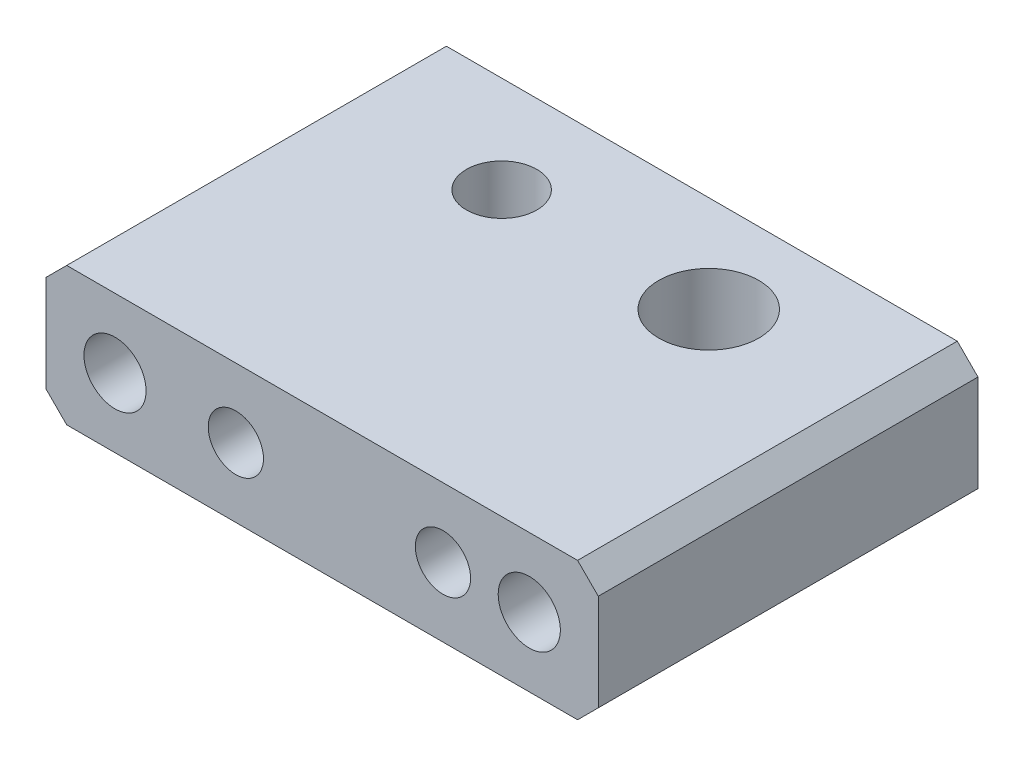
ISO-10303-21;
HEADER;
FILE_DESCRIPTION(('STEP AP214'),'2;1');
FILE_NAME('part.step','',(''),(''),'','','');
FILE_SCHEMA(('AUTOMOTIVE_DESIGN { 1 0 10303 214 1 1 1 1 }'));
ENDSEC;
DATA;
#1=APPLICATION_CONTEXT('core data for automotive mechanical design processes');
#2=APPLICATION_PROTOCOL_DEFINITION('international standard','automotive_design',2000,#1);
#3=PRODUCT_CONTEXT('',#1,'mechanical');
#4=PRODUCT('Part','Part','',(#3));
#5=PRODUCT_RELATED_PRODUCT_CATEGORY('part','',(#4));
#6=PRODUCT_DEFINITION_FORMATION('','',#4);
#7=PRODUCT_DEFINITION_CONTEXT('part definition',#1,'design');
#8=PRODUCT_DEFINITION('design','',#6,#7);
#9=PRODUCT_DEFINITION_SHAPE('','',#8);
#10=(LENGTH_UNIT() NAMED_UNIT(*) SI_UNIT(.MILLI.,.METRE.));
#11=(NAMED_UNIT(*) PLANE_ANGLE_UNIT() SI_UNIT($,.RADIAN.));
#12=(NAMED_UNIT(*) SI_UNIT($,.STERADIAN.) SOLID_ANGLE_UNIT());
#13=UNCERTAINTY_MEASURE_WITH_UNIT(LENGTH_MEASURE(1.E-05),#10,'distance_accuracy_value','');
#14=(GEOMETRIC_REPRESENTATION_CONTEXT(3) GLOBAL_UNCERTAINTY_ASSIGNED_CONTEXT((#13)) GLOBAL_UNIT_ASSIGNED_CONTEXT((#10,
#11,#12)) REPRESENTATION_CONTEXT('',''));
#15=CARTESIAN_POINT('',(0.,0.,0.));
#16=DIRECTION('',(0.,0.,1.));
#17=DIRECTION('',(1.,0.,0.));
#18=AXIS2_PLACEMENT_3D('',#15,#16,#17);
#19=CARTESIAN_POINT('',(0.,10.,0.));
#20=DIRECTION('',(1.,0.,0.));
#21=DIRECTION('',(0.,0.,-1.));
#22=AXIS2_PLACEMENT_3D('',#19,#20,#21);
#23=PLANE('',#22);
#24=DIRECTION('',(0.,-1.,0.));
#25=VECTOR('',#24,1.);
#26=CARTESIAN_POINT('',(0.,10.,0.));
#27=LINE('',#26,#25);
#28=CARTESIAN_POINT('',(0.,7.00000000000001,0.));
#29=VERTEX_POINT('',#28);
#30=CARTESIAN_POINT('',(0.,-7.00000000000001,0.));
#31=VERTEX_POINT('',#30);
#32=EDGE_CURVE('E189',#29,#31,#27,.T.);
#33=ORIENTED_EDGE('',*,*,#32,.F.);
#34=DIRECTION('',(0.,0.,-1.));
#35=VECTOR('',#34,1.);
#36=CARTESIAN_POINT('',(0.,7.00000000000001,0.));
#37=LINE('',#36,#35);
#38=CARTESIAN_POINT('',(0.,7.00000000000001,-55.));
#39=VERTEX_POINT('',#38);
#40=EDGE_CURVE('E209',#29,#39,#37,.T.);
#41=ORIENTED_EDGE('',*,*,#40,.T.);
#42=DIRECTION('',(0.,-1.,0.));
#43=VECTOR('',#42,1.);
#44=CARTESIAN_POINT('',(0.,10.,-55.));
#45=LINE('',#44,#43);
#46=CARTESIAN_POINT('',(0.,-7.00000000000001,-55.));
#47=VERTEX_POINT('',#46);
#48=EDGE_CURVE('E177',#39,#47,#45,.T.);
#49=ORIENTED_EDGE('',*,*,#48,.T.);
#50=DIRECTION('',(0.,0.,1.));
#51=VECTOR('',#50,1.);
#52=CARTESIAN_POINT('',(0.,-7.00000000000001,0.));
#53=LINE('',#52,#51);
#54=EDGE_CURVE('E206',#47,#31,#53,.T.);
#55=ORIENTED_EDGE('',*,*,#54,.T.);
#56=EDGE_LOOP('',(#33,#41,#49,#55));
#57=FACE_BOUND('',#56,.T.);
#58=ADVANCED_FACE('F41',(#57),#23,.F.);
#59=CARTESIAN_POINT('',(0.,10.,0.));
#60=DIRECTION('',(0.,0.,-1.));
#61=DIRECTION('',(-1.,0.,0.));
#62=AXIS2_PLACEMENT_3D('',#59,#60,#61);
#63=PLANE('',#62);
#64=CARTESIAN_POINT('',(27.5,0.,0.));
#65=DIRECTION('',(0.,0.,1.));
#66=DIRECTION('',(1.,0.,0.));
#67=AXIS2_PLACEMENT_3D('',#64,#65,#66);
#68=CIRCLE('',#67,3.99999999999999);
#69=CARTESIAN_POINT('',(31.5,0.,0.));
#70=VERTEX_POINT('',#69);
#71=EDGE_CURVE('E123',#70,#70,#68,.T.);
#72=ORIENTED_EDGE('',*,*,#71,.F.);
#73=EDGE_LOOP('',(#72));
#74=FACE_BOUND('',#73,.T.);
#75=CARTESIAN_POINT('',(57.5,0.,0.));
#76=DIRECTION('',(0.,0.,1.));
#77=DIRECTION('',(1.,0.,0.));
#78=AXIS2_PLACEMENT_3D('',#75,#76,#77);
#79=CIRCLE('',#78,3.99999999999999);
#80=CARTESIAN_POINT('',(61.5,0.,0.));
#81=VERTEX_POINT('',#80);
#82=EDGE_CURVE('E122',#81,#81,#79,.T.);
#83=ORIENTED_EDGE('',*,*,#82,.F.);
#84=EDGE_LOOP('',(#83));
#85=FACE_BOUND('',#84,.T.);
#86=CARTESIAN_POINT('',(70.,0.,0.));
#87=DIRECTION('',(0.,0.,-1.));
#88=DIRECTION('',(-1.,0.,0.));
#89=AXIS2_PLACEMENT_3D('',#86,#87,#88);
#90=CIRCLE('',#89,4.49999999999999);
#91=CARTESIAN_POINT('',(65.5,0.,0.));
#92=VERTEX_POINT('',#91);
#93=EDGE_CURVE('E142',#92,#92,#90,.T.);
#94=ORIENTED_EDGE('',*,*,#93,.T.);
#95=EDGE_LOOP('',(#94));
#96=FACE_BOUND('',#95,.T.);
#97=CARTESIAN_POINT('',(10.,0.,0.));
#98=DIRECTION('',(0.,0.,-1.));
#99=DIRECTION('',(-1.,0.,0.));
#100=AXIS2_PLACEMENT_3D('',#97,#98,#99);
#101=CIRCLE('',#100,4.49999999999999);
#102=CARTESIAN_POINT('',(5.50000000000002,0.,0.));
#103=VERTEX_POINT('',#102);
#104=EDGE_CURVE('E154',#103,#103,#101,.T.);
#105=ORIENTED_EDGE('',*,*,#104,.T.);
#106=EDGE_LOOP('',(#105));
#107=FACE_BOUND('',#106,.T.);
#108=DIRECTION('',(1.,0.,0.));
#109=VECTOR('',#108,1.);
#110=CARTESIAN_POINT('',(0.,10.,0.));
#111=LINE('',#110,#109);
#112=CARTESIAN_POINT('',(2.99999999999999,10.,0.));
#113=VERTEX_POINT('',#112);
#114=CARTESIAN_POINT('',(77.,10.,0.));
#115=VERTEX_POINT('',#114);
#116=EDGE_CURVE('E170',#113,#115,#111,.T.);
#117=ORIENTED_EDGE('',*,*,#116,.F.);
#118=DIRECTION('',(0.707106781186548,0.707106781186548,0.));
#119=VECTOR('',#118,1.);
#120=CARTESIAN_POINT('',(2.99999999999999,10.,0.));
#121=LINE('',#120,#119);
#122=EDGE_CURVE('E204',#113,#29,#121,.F.);
#123=ORIENTED_EDGE('',*,*,#122,.T.);
#124=ORIENTED_EDGE('',*,*,#32,.T.);
#125=DIRECTION('',(0.707106781186549,-0.707106781186546,0.));
#126=VECTOR('',#125,1.);
#127=CARTESIAN_POINT('',(0.,-7.00000000000001,0.));
#128=LINE('',#127,#126);
#129=CARTESIAN_POINT('',(3.,-10.,0.));
#130=VERTEX_POINT('',#129);
#131=EDGE_CURVE('E202',#31,#130,#128,.T.);
#132=ORIENTED_EDGE('',*,*,#131,.T.);
#133=DIRECTION('',(1.,0.,0.));
#134=VECTOR('',#133,1.);
#135=CARTESIAN_POINT('',(0.,-10.,0.));
#136=LINE('',#135,#134);
#137=CARTESIAN_POINT('',(77.,-10.,0.));
#138=VERTEX_POINT('',#137);
#139=EDGE_CURVE('E169',#130,#138,#136,.T.);
#140=ORIENTED_EDGE('',*,*,#139,.T.);
#141=DIRECTION('',(0.707106781186549,0.707106781186546,0.));
#142=VECTOR('',#141,1.);
#143=CARTESIAN_POINT('',(80.,-7.00000000000001,0.));
#144=LINE('',#143,#142);
#145=CARTESIAN_POINT('',(80.,-7.00000000000001,0.));
#146=VERTEX_POINT('',#145);
#147=EDGE_CURVE('E200',#138,#146,#144,.T.);
#148=ORIENTED_EDGE('',*,*,#147,.T.);
#149=DIRECTION('',(0.,-1.,0.));
#150=VECTOR('',#149,1.);
#151=CARTESIAN_POINT('',(80.,10.,0.));
#152=LINE('',#151,#150);
#153=CARTESIAN_POINT('',(80.,6.99999999999998,0.));
#154=VERTEX_POINT('',#153);
#155=EDGE_CURVE('E186',#154,#146,#152,.T.);
#156=ORIENTED_EDGE('',*,*,#155,.F.);
#157=DIRECTION('',(0.707106781186544,-0.707106781186551,0.));
#158=VECTOR('',#157,1.);
#159=CARTESIAN_POINT('',(77.,10.,0.));
#160=LINE('',#159,#158);
#161=EDGE_CURVE('E198',#154,#115,#160,.F.);
#162=ORIENTED_EDGE('',*,*,#161,.T.);
#163=EDGE_LOOP('',(#117,#123,#124,#132,#140,#148,#156,#162));
#164=FACE_BOUND('',#163,.T.);
#165=ADVANCED_FACE('F228',(#74,#85,#96,#107,#164),#63,.F.);
#166=CARTESIAN_POINT('',(80.,10.,0.));
#167=DIRECTION('',(-1.,0.,0.));
#168=DIRECTION('',(0.,0.,1.));
#169=AXIS2_PLACEMENT_3D('',#166,#167,#168);
#170=PLANE('',#169);
#171=ORIENTED_EDGE('',*,*,#155,.T.);
#172=DIRECTION('',(0.,0.,-1.));
#173=VECTOR('',#172,1.);
#174=CARTESIAN_POINT('',(80.,-7.00000000000001,-55.));
#175=LINE('',#174,#173);
#176=CARTESIAN_POINT('',(80.,-7.00000000000001,-55.));
#177=VERTEX_POINT('',#176);
#178=EDGE_CURVE('E11',#146,#177,#175,.T.);
#179=ORIENTED_EDGE('',*,*,#178,.T.);
#180=DIRECTION('',(0.,-1.,0.));
#181=VECTOR('',#180,1.);
#182=CARTESIAN_POINT('',(80.,10.,-55.));
#183=LINE('',#182,#181);
#184=CARTESIAN_POINT('',(80.,6.99999999999998,-55.));
#185=VERTEX_POINT('',#184);
#186=EDGE_CURVE('E184',#185,#177,#183,.T.);
#187=ORIENTED_EDGE('',*,*,#186,.F.);
#188=DIRECTION('',(0.,0.,1.));
#189=VECTOR('',#188,1.);
#190=CARTESIAN_POINT('',(80.,6.99999999999998,0.));
#191=LINE('',#190,#189);
#192=EDGE_CURVE('E50',#185,#154,#191,.T.);
#193=ORIENTED_EDGE('',*,*,#192,.T.);
#194=EDGE_LOOP('',(#171,#179,#187,#193));
#195=FACE_BOUND('',#194,.T.);
#196=ADVANCED_FACE('F223',(#195),#170,.F.);
#197=CARTESIAN_POINT('',(0.,10.,-55.));
#198=DIRECTION('',(0.,0.,1.));
#199=DIRECTION('',(1.,0.,0.));
#200=AXIS2_PLACEMENT_3D('',#197,#198,#199);
#201=PLANE('',#200);
#202=CARTESIAN_POINT('',(70.,0.,-55.));
#203=DIRECTION('',(0.,0.,-1.));
#204=DIRECTION('',(-1.,0.,0.));
#205=AXIS2_PLACEMENT_3D('',#202,#203,#204);
#206=CIRCLE('',#205,6.99999999999999);
#207=CARTESIAN_POINT('',(63.,0.,-55.));
#208=VERTEX_POINT('',#207);
#209=EDGE_CURVE('E133',#208,#208,#206,.T.);
#210=ORIENTED_EDGE('',*,*,#209,.F.);
#211=EDGE_LOOP('',(#210));
#212=FACE_BOUND('',#211,.T.);
#213=CARTESIAN_POINT('',(10.,0.,-55.));
#214=DIRECTION('',(0.,0.,-1.));
#215=DIRECTION('',(-1.,0.,0.));
#216=AXIS2_PLACEMENT_3D('',#213,#214,#215);
#217=CIRCLE('',#216,7.);
#218=CARTESIAN_POINT('',(3.00000000000001,0.,-55.));
#219=VERTEX_POINT('',#218);
#220=EDGE_CURVE('E145',#219,#219,#217,.T.);
#221=ORIENTED_EDGE('',*,*,#220,.F.);
#222=EDGE_LOOP('',(#221));
#223=FACE_BOUND('',#222,.T.);
#224=ORIENTED_EDGE('',*,*,#48,.F.);
#225=DIRECTION('',(-0.707106781186548,-0.707106781186548,0.));
#226=VECTOR('',#225,1.);
#227=CARTESIAN_POINT('',(2.99999999999999,10.,-55.));
#228=LINE('',#227,#226);
#229=CARTESIAN_POINT('',(2.99999999999999,10.,-55.));
#230=VERTEX_POINT('',#229);
#231=EDGE_CURVE('E215',#39,#230,#228,.F.);
#232=ORIENTED_EDGE('',*,*,#231,.T.);
#233=DIRECTION('',(-1.,0.,0.));
#234=VECTOR('',#233,1.);
#235=CARTESIAN_POINT('',(0.,10.,-55.));
#236=LINE('',#235,#234);
#237=CARTESIAN_POINT('',(77.,10.,-55.));
#238=VERTEX_POINT('',#237);
#239=EDGE_CURVE('E173',#238,#230,#236,.T.);
#240=ORIENTED_EDGE('',*,*,#239,.F.);
#241=DIRECTION('',(-0.707106781186544,0.707106781186551,0.));
#242=VECTOR('',#241,1.);
#243=CARTESIAN_POINT('',(77.,10.,-55.));
#244=LINE('',#243,#242);
#245=EDGE_CURVE('E64',#238,#185,#244,.F.);
#246=ORIENTED_EDGE('',*,*,#245,.T.);
#247=ORIENTED_EDGE('',*,*,#186,.T.);
#248=DIRECTION('',(-0.707106781186549,-0.707106781186546,0.));
#249=VECTOR('',#248,1.);
#250=CARTESIAN_POINT('',(80.,-7.00000000000001,-55.));
#251=LINE('',#250,#249);
#252=CARTESIAN_POINT('',(77.,-10.,-55.));
#253=VERTEX_POINT('',#252);
#254=EDGE_CURVE('E57',#177,#253,#251,.T.);
#255=ORIENTED_EDGE('',*,*,#254,.T.);
#256=DIRECTION('',(-1.,0.,0.));
#257=VECTOR('',#256,1.);
#258=CARTESIAN_POINT('',(0.,-10.,-55.));
#259=LINE('',#258,#257);
#260=CARTESIAN_POINT('',(3.,-10.,-55.));
#261=VERTEX_POINT('',#260);
#262=EDGE_CURVE('E174',#253,#261,#259,.T.);
#263=ORIENTED_EDGE('',*,*,#262,.T.);
#264=DIRECTION('',(-0.707106781186549,0.707106781186546,0.));
#265=VECTOR('',#264,1.);
#266=CARTESIAN_POINT('',(0.,-7.00000000000001,-55.));
#267=LINE('',#266,#265);
#268=EDGE_CURVE('E213',#261,#47,#267,.T.);
#269=ORIENTED_EDGE('',*,*,#268,.T.);
#270=EDGE_LOOP('',(#224,#232,#240,#246,#247,#255,#263,#269));
#271=FACE_BOUND('',#270,.T.);
#272=ADVANCED_FACE('F235',(#212,#223,#271),#201,.F.);
#273=CARTESIAN_POINT('',(0.,10.,0.));
#274=DIRECTION('',(0.,-1.,0.));
#275=DIRECTION('',(0.,0.,-1.));
#276=AXIS2_PLACEMENT_3D('',#273,#274,#275);
#277=PLANE('',#276);
#278=CARTESIAN_POINT('',(55.,10.,-41.));
#279=DIRECTION('',(0.,1.,0.));
#280=DIRECTION('',(0.,0.,1.));
#281=AXIS2_PLACEMENT_3D('',#278,#279,#280);
#282=CIRCLE('',#281,7.25);
#283=CARTESIAN_POINT('',(55.,10.,-33.75));
#284=VERTEX_POINT('',#283);
#285=EDGE_CURVE('E157',#284,#284,#282,.T.);
#286=ORIENTED_EDGE('',*,*,#285,.F.);
#287=EDGE_LOOP('',(#286));
#288=FACE_BOUND('',#287,.T.);
#289=CARTESIAN_POINT('',(25.,10.,-41.));
#290=DIRECTION('',(0.,1.,0.));
#291=DIRECTION('',(0.,0.,1.));
#292=AXIS2_PLACEMENT_3D('',#289,#290,#291);
#293=CIRCLE('',#292,5.09999999999999);
#294=CARTESIAN_POINT('',(25.,10.,-35.9));
#295=VERTEX_POINT('',#294);
#296=EDGE_CURVE('E163',#295,#295,#293,.T.);
#297=ORIENTED_EDGE('',*,*,#296,.F.);
#298=EDGE_LOOP('',(#297));
#299=FACE_BOUND('',#298,.T.);
#300=ORIENTED_EDGE('',*,*,#239,.T.);
#301=DIRECTION('',(0.,0.,1.));
#302=VECTOR('',#301,1.);
#303=CARTESIAN_POINT('',(2.99999999999999,10.,0.));
#304=LINE('',#303,#302);
#305=EDGE_CURVE('E195',#230,#113,#304,.T.);
#306=ORIENTED_EDGE('',*,*,#305,.T.);
#307=ORIENTED_EDGE('',*,*,#116,.T.);
#308=DIRECTION('',(0.,0.,-1.));
#309=VECTOR('',#308,1.);
#310=CARTESIAN_POINT('',(77.,10.,0.));
#311=LINE('',#310,#309);
#312=EDGE_CURVE('E192',#115,#238,#311,.T.);
#313=ORIENTED_EDGE('',*,*,#312,.T.);
#314=EDGE_LOOP('',(#300,#306,#307,#313));
#315=FACE_BOUND('',#314,.T.);
#316=ADVANCED_FACE('F232',(#288,#299,#315),#277,.F.);
#317=CARTESIAN_POINT('',(0.,-10.,0.));
#318=DIRECTION('',(0.,-1.,0.));
#319=DIRECTION('',(0.,0.,-1.));
#320=AXIS2_PLACEMENT_3D('',#317,#318,#319);
#321=PLANE('',#320);
#322=CARTESIAN_POINT('',(55.,-10.,-41.));
#323=DIRECTION('',(0.,1.,0.));
#324=DIRECTION('',(0.,0.,1.));
#325=AXIS2_PLACEMENT_3D('',#322,#323,#324);
#326=CIRCLE('',#325,7.24999999999999);
#327=CARTESIAN_POINT('',(55.,-10.,-33.75));
#328=VERTEX_POINT('',#327);
#329=EDGE_CURVE('E160',#328,#328,#326,.T.);
#330=ORIENTED_EDGE('',*,*,#329,.T.);
#331=EDGE_LOOP('',(#330));
#332=FACE_BOUND('',#331,.T.);
#333=CARTESIAN_POINT('',(25.,-10.,-41.));
#334=DIRECTION('',(0.,1.,0.));
#335=DIRECTION('',(0.,0.,1.));
#336=AXIS2_PLACEMENT_3D('',#333,#334,#335);
#337=CIRCLE('',#336,5.09999999999999);
#338=CARTESIAN_POINT('',(25.,-10.,-35.9));
#339=VERTEX_POINT('',#338);
#340=EDGE_CURVE('E166',#339,#339,#337,.T.);
#341=ORIENTED_EDGE('',*,*,#340,.T.);
#342=EDGE_LOOP('',(#341));
#343=FACE_BOUND('',#342,.T.);
#344=ORIENTED_EDGE('',*,*,#139,.F.);
#345=DIRECTION('',(0.,0.,-1.));
#346=VECTOR('',#345,1.);
#347=CARTESIAN_POINT('',(3.,-10.,-55.));
#348=LINE('',#347,#346);
#349=EDGE_CURVE('E219',#130,#261,#348,.T.);
#350=ORIENTED_EDGE('',*,*,#349,.T.);
#351=ORIENTED_EDGE('',*,*,#262,.F.);
#352=DIRECTION('',(0.,0.,1.));
#353=VECTOR('',#352,1.);
#354=CARTESIAN_POINT('',(77.,-10.,0.));
#355=LINE('',#354,#353);
#356=EDGE_CURVE('E217',#253,#138,#355,.T.);
#357=ORIENTED_EDGE('',*,*,#356,.T.);
#358=EDGE_LOOP('',(#344,#350,#351,#357));
#359=FACE_BOUND('',#358,.T.);
#360=ADVANCED_FACE('F249',(#332,#343,#359),#321,.T.);
#361=CARTESIAN_POINT('',(25.,10.,-41.));
#362=DIRECTION('',(0.,1.,0.));
#363=DIRECTION('',(0.,0.,1.));
#364=AXIS2_PLACEMENT_3D('',#361,#362,#363);
#365=CYLINDRICAL_SURFACE('',#364,5.09999999999999);
#366=ORIENTED_EDGE('',*,*,#340,.F.);
#367=EDGE_LOOP('',(#366));
#368=FACE_BOUND('',#367,.T.);
#369=ORIENTED_EDGE('',*,*,#296,.T.);
#370=EDGE_LOOP('',(#369));
#371=FACE_BOUND('',#370,.T.);
#372=ADVANCED_FACE('F321',(#368,#371),#365,.F.);
#373=CARTESIAN_POINT('',(55.,10.,-41.));
#374=DIRECTION('',(0.,1.,0.));
#375=DIRECTION('',(0.,0.,1.));
#376=AXIS2_PLACEMENT_3D('',#373,#374,#375);
#377=CYLINDRICAL_SURFACE('',#376,7.25);
#378=ORIENTED_EDGE('',*,*,#329,.F.);
#379=EDGE_LOOP('',(#378));
#380=FACE_BOUND('',#379,.T.);
#381=ORIENTED_EDGE('',*,*,#285,.T.);
#382=EDGE_LOOP('',(#381));
#383=FACE_BOUND('',#382,.T.);
#384=ADVANCED_FACE('F317',(#380,#383),#377,.F.);
#385=CARTESIAN_POINT('',(10.,0.,-55.));
#386=DIRECTION('',(0.,0.,-1.));
#387=DIRECTION('',(-1.,0.,0.));
#388=AXIS2_PLACEMENT_3D('',#385,#386,#387);
#389=CYLINDRICAL_SURFACE('',#388,4.5);
#390=ORIENTED_EDGE('',*,*,#104,.F.);
#391=EDGE_LOOP('',(#390));
#392=FACE_BOUND('',#391,.T.);
#393=CARTESIAN_POINT('',(10.,0.,-25.));
#394=DIRECTION('',(0.,0.,-1.));
#395=DIRECTION('',(-1.,0.,0.));
#396=AXIS2_PLACEMENT_3D('',#393,#394,#395);
#397=CIRCLE('',#396,4.5);
#398=CARTESIAN_POINT('',(5.50000000000001,0.,-25.));
#399=VERTEX_POINT('',#398);
#400=EDGE_CURVE('E151',#399,#399,#397,.T.);
#401=ORIENTED_EDGE('',*,*,#400,.T.);
#402=EDGE_LOOP('',(#401));
#403=FACE_BOUND('',#402,.T.);
#404=ADVANCED_FACE('F313',(#392,#403),#389,.F.);
#405=CARTESIAN_POINT('',(14.5,0.,-25.));
#406=DIRECTION('',(0.,0.,1.));
#407=DIRECTION('',(1.,0.,0.));
#408=AXIS2_PLACEMENT_3D('',#405,#406,#407);
#409=PLANE('',#408);
#410=ORIENTED_EDGE('',*,*,#400,.F.);
#411=EDGE_LOOP('',(#410));
#412=FACE_BOUND('',#411,.T.);
#413=CARTESIAN_POINT('',(10.,0.,-25.));
#414=DIRECTION('',(0.,0.,-1.));
#415=DIRECTION('',(-1.,0.,0.));
#416=AXIS2_PLACEMENT_3D('',#413,#414,#415);
#417=CIRCLE('',#416,6.99999999999999);
#418=CARTESIAN_POINT('',(3.00000000000002,0.,-25.));
#419=VERTEX_POINT('',#418);
#420=EDGE_CURVE('E148',#419,#419,#417,.T.);
#421=ORIENTED_EDGE('',*,*,#420,.T.);
#422=EDGE_LOOP('',(#421));
#423=FACE_BOUND('',#422,.T.);
#424=ADVANCED_FACE('F309',(#412,#423),#409,.F.);
#425=CARTESIAN_POINT('',(10.,0.,-55.));
#426=DIRECTION('',(0.,0.,-1.));
#427=DIRECTION('',(-1.,0.,0.));
#428=AXIS2_PLACEMENT_3D('',#425,#426,#427);
#429=CYLINDRICAL_SURFACE('',#428,6.99999999999999);
#430=ORIENTED_EDGE('',*,*,#420,.F.);
#431=EDGE_LOOP('',(#430));
#432=FACE_BOUND('',#431,.T.);
#433=ORIENTED_EDGE('',*,*,#220,.T.);
#434=EDGE_LOOP('',(#433));
#435=FACE_BOUND('',#434,.T.);
#436=ADVANCED_FACE('F305',(#432,#435),#429,.F.);
#437=CARTESIAN_POINT('',(70.,0.,-55.));
#438=DIRECTION('',(0.,0.,-1.));
#439=DIRECTION('',(-1.,0.,0.));
#440=AXIS2_PLACEMENT_3D('',#437,#438,#439);
#441=CYLINDRICAL_SURFACE('',#440,4.5);
#442=ORIENTED_EDGE('',*,*,#93,.F.);
#443=EDGE_LOOP('',(#442));
#444=FACE_BOUND('',#443,.T.);
#445=CARTESIAN_POINT('',(70.,0.,-25.));
#446=DIRECTION('',(0.,0.,-1.));
#447=DIRECTION('',(-1.,0.,0.));
#448=AXIS2_PLACEMENT_3D('',#445,#446,#447);
#449=CIRCLE('',#448,4.5);
#450=CARTESIAN_POINT('',(65.5,0.,-25.));
#451=VERTEX_POINT('',#450);
#452=EDGE_CURVE('E139',#451,#451,#449,.T.);
#453=ORIENTED_EDGE('',*,*,#452,.T.);
#454=EDGE_LOOP('',(#453));
#455=FACE_BOUND('',#454,.T.);
#456=ADVANCED_FACE('F301',(#444,#455),#441,.F.);
#457=CARTESIAN_POINT('',(74.5,0.,-25.));
#458=DIRECTION('',(0.,0.,1.));
#459=DIRECTION('',(1.,0.,0.));
#460=AXIS2_PLACEMENT_3D('',#457,#458,#459);
#461=PLANE('',#460);
#462=ORIENTED_EDGE('',*,*,#452,.F.);
#463=EDGE_LOOP('',(#462));
#464=FACE_BOUND('',#463,.T.);
#465=CARTESIAN_POINT('',(70.,0.,-25.));
#466=DIRECTION('',(0.,0.,-1.));
#467=DIRECTION('',(-1.,0.,0.));
#468=AXIS2_PLACEMENT_3D('',#465,#466,#467);
#469=CIRCLE('',#468,6.99999999999999);
#470=CARTESIAN_POINT('',(63.,0.,-25.));
#471=VERTEX_POINT('',#470);
#472=EDGE_CURVE('E136',#471,#471,#469,.T.);
#473=ORIENTED_EDGE('',*,*,#472,.T.);
#474=EDGE_LOOP('',(#473));
#475=FACE_BOUND('',#474,.T.);
#476=ADVANCED_FACE('F297',(#464,#475),#461,.F.);
#477=CARTESIAN_POINT('',(70.,0.,-55.));
#478=DIRECTION('',(0.,0.,-1.));
#479=DIRECTION('',(-1.,0.,0.));
#480=AXIS2_PLACEMENT_3D('',#477,#478,#479);
#481=CYLINDRICAL_SURFACE('',#480,6.99999999999999);
#482=ORIENTED_EDGE('',*,*,#472,.F.);
#483=EDGE_LOOP('',(#482));
#484=FACE_BOUND('',#483,.T.);
#485=ORIENTED_EDGE('',*,*,#209,.T.);
#486=EDGE_LOOP('',(#485));
#487=FACE_BOUND('',#486,.T.);
#488=ADVANCED_FACE('F293',(#484,#487),#481,.F.);
#489=CARTESIAN_POINT('',(57.5,0.,-30.));
#490=DIRECTION('',(0.,0.,1.));
#491=DIRECTION('',(1.,0.,0.));
#492=AXIS2_PLACEMENT_3D('',#489,#490,#491);
#493=CONICAL_SURFACE('',#492,4.,1.02974425867665);
#494=CARTESIAN_POINT('',(57.5,0.,-32.4034424761102));
#495=VERTEX_POINT('',#494);
#496=VERTEX_LOOP('',#495);
#497=FACE_BOUND('',#496,.T.);
#498=CARTESIAN_POINT('',(57.5,0.,-30.));
#499=DIRECTION('',(0.,0.,1.));
#500=DIRECTION('',(1.,0.,0.));
#501=AXIS2_PLACEMENT_3D('',#498,#499,#500);
#502=CIRCLE('',#501,4.);
#503=CARTESIAN_POINT('',(61.5,0.,-30.));
#504=VERTEX_POINT('',#503);
#505=EDGE_CURVE('E126',#504,#504,#502,.T.);
#506=ORIENTED_EDGE('',*,*,#505,.T.);
#507=EDGE_LOOP('',(#506));
#508=FACE_BOUND('',#507,.T.);
#509=ADVANCED_FACE('F289',(#497,#508),#493,.F.);
#510=CARTESIAN_POINT('',(57.5,0.,0.));
#511=DIRECTION('',(0.,0.,1.));
#512=DIRECTION('',(1.,0.,0.));
#513=AXIS2_PLACEMENT_3D('',#510,#511,#512);
#514=CYLINDRICAL_SURFACE('',#513,3.99999999999999);
#515=ORIENTED_EDGE('',*,*,#505,.F.);
#516=EDGE_LOOP('',(#515));
#517=FACE_BOUND('',#516,.T.);
#518=ORIENTED_EDGE('',*,*,#82,.T.);
#519=EDGE_LOOP('',(#518));
#520=FACE_BOUND('',#519,.T.);
#521=ADVANCED_FACE('F116',(#517,#520),#514,.F.);
#522=CARTESIAN_POINT('',(27.5,0.,-30.));
#523=DIRECTION('',(0.,0.,1.));
#524=DIRECTION('',(1.,0.,0.));
#525=AXIS2_PLACEMENT_3D('',#522,#523,#524);
#526=CONICAL_SURFACE('',#525,3.99999999999999,1.02974425867665);
#527=CARTESIAN_POINT('',(27.5,0.,-32.4034424761102));
#528=VERTEX_POINT('',#527);
#529=VERTEX_LOOP('',#528);
#530=FACE_BOUND('',#529,.T.);
#531=CARTESIAN_POINT('',(27.5,0.,-30.));
#532=DIRECTION('',(0.,0.,1.));
#533=DIRECTION('',(1.,0.,0.));
#534=AXIS2_PLACEMENT_3D('',#531,#532,#533);
#535=CIRCLE('',#534,3.99999999999999);
#536=CARTESIAN_POINT('',(31.5,0.,-30.));
#537=VERTEX_POINT('',#536);
#538=EDGE_CURVE('E120',#537,#537,#535,.T.);
#539=ORIENTED_EDGE('',*,*,#538,.T.);
#540=EDGE_LOOP('',(#539));
#541=FACE_BOUND('',#540,.T.);
#542=ADVANCED_FACE('F112',(#530,#541),#526,.F.);
#543=CARTESIAN_POINT('',(27.5,0.,0.));
#544=DIRECTION('',(0.,0.,1.));
#545=DIRECTION('',(1.,0.,0.));
#546=AXIS2_PLACEMENT_3D('',#543,#544,#545);
#547=CYLINDRICAL_SURFACE('',#546,3.99999999999999);
#548=ORIENTED_EDGE('',*,*,#538,.F.);
#549=EDGE_LOOP('',(#548));
#550=FACE_BOUND('',#549,.T.);
#551=ORIENTED_EDGE('',*,*,#71,.T.);
#552=EDGE_LOOP('',(#551));
#553=FACE_BOUND('',#552,.T.);
#554=ADVANCED_FACE('F115',(#550,#553),#547,.F.);
#555=CARTESIAN_POINT('',(2.99999999999999,10.,0.));
#556=DIRECTION('',(0.707106781186548,-0.707106781186548,0.));
#557=DIRECTION('',(0.,0.,1.));
#558=AXIS2_PLACEMENT_3D('',#555,#556,#557);
#559=PLANE('',#558);
#560=ORIENTED_EDGE('',*,*,#231,.F.);
#561=ORIENTED_EDGE('',*,*,#40,.F.);
#562=ORIENTED_EDGE('',*,*,#122,.F.);
#563=ORIENTED_EDGE('',*,*,#305,.F.);
#564=EDGE_LOOP('',(#560,#561,#562,#563));
#565=FACE_BOUND('',#564,.T.);
#566=ADVANCED_FACE('F239',(#565),#559,.F.);
#567=CARTESIAN_POINT('',(0.,-7.00000000000001,0.));
#568=DIRECTION('',(-0.707106781186546,-0.707106781186549,0.));
#569=DIRECTION('',(0.,0.,-1.));
#570=AXIS2_PLACEMENT_3D('',#567,#568,#569);
#571=PLANE('',#570);
#572=ORIENTED_EDGE('',*,*,#268,.F.);
#573=ORIENTED_EDGE('',*,*,#349,.F.);
#574=ORIENTED_EDGE('',*,*,#131,.F.);
#575=ORIENTED_EDGE('',*,*,#54,.F.);
#576=EDGE_LOOP('',(#572,#573,#574,#575));
#577=FACE_BOUND('',#576,.T.);
#578=ADVANCED_FACE('F245',(#577),#571,.T.);
#579=CARTESIAN_POINT('',(80.,-7.00000000000001,0.));
#580=DIRECTION('',(0.707106781186546,-0.707106781186549,0.));
#581=DIRECTION('',(0.,0.,1.));
#582=AXIS2_PLACEMENT_3D('',#579,#580,#581);
#583=PLANE('',#582);
#584=ORIENTED_EDGE('',*,*,#147,.F.);
#585=ORIENTED_EDGE('',*,*,#356,.F.);
#586=ORIENTED_EDGE('',*,*,#254,.F.);
#587=ORIENTED_EDGE('',*,*,#178,.F.);
#588=EDGE_LOOP('',(#584,#585,#586,#587));
#589=FACE_BOUND('',#588,.T.);
#590=ADVANCED_FACE('F251',(#589),#583,.T.);
#591=CARTESIAN_POINT('',(77.,10.,0.));
#592=DIRECTION('',(-0.707106781186551,-0.707106781186544,0.));
#593=DIRECTION('',(0.,0.,-1.));
#594=AXIS2_PLACEMENT_3D('',#591,#592,#593);
#595=PLANE('',#594);
#596=ORIENTED_EDGE('',*,*,#161,.F.);
#597=ORIENTED_EDGE('',*,*,#192,.F.);
#598=ORIENTED_EDGE('',*,*,#245,.F.);
#599=ORIENTED_EDGE('',*,*,#312,.F.);
#600=EDGE_LOOP('',(#596,#597,#598,#599));
#601=FACE_BOUND('',#600,.T.);
#602=ADVANCED_FACE('F44',(#601),#595,.F.);
#603=CLOSED_SHELL('',(#58,#165,#196,#272,#316,#360,#372,#384,#404,#424,#436,#456,#476,#488,#509,
#521,#542,#554,#566,#578,#590,#602));
#604=MANIFOLD_SOLID_BREP('B2',#603);
#605=ADVANCED_BREP_SHAPE_REPRESENTATION('',(#18,#604),#14);
#606=SHAPE_DEFINITION_REPRESENTATION(#9,#605);
ENDSEC;
END-ISO-10303-21;
